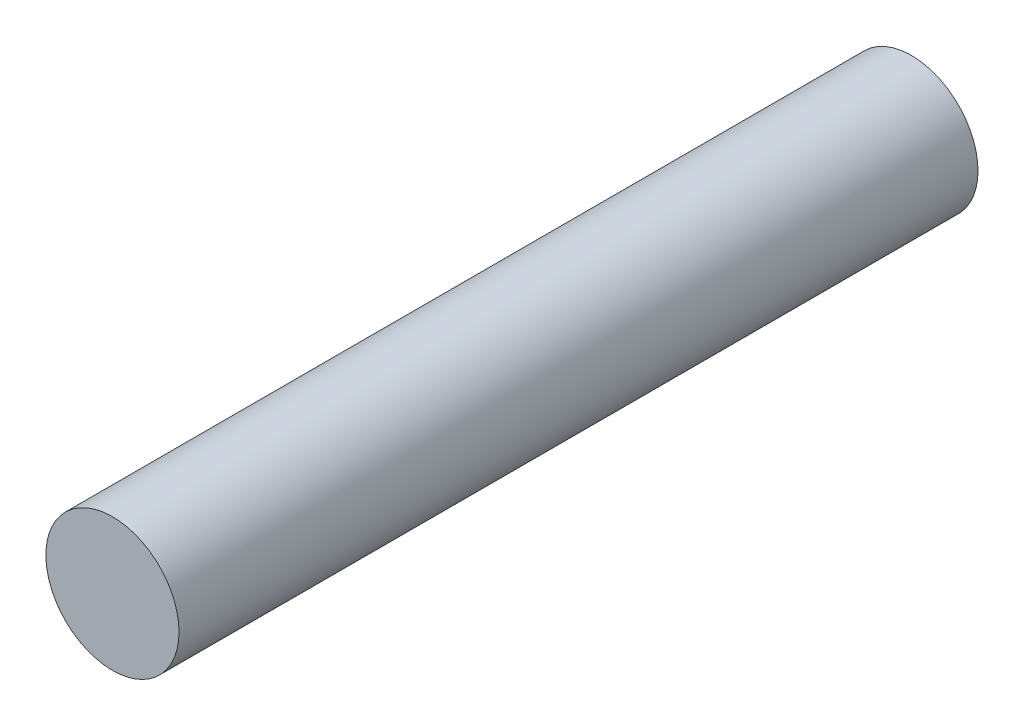
ISO-10303-21;
HEADER;
FILE_DESCRIPTION(('STEP AP214'),'2;1');
FILE_NAME('part.step','',(''),(''),'','','');
FILE_SCHEMA(('AUTOMOTIVE_DESIGN { 1 0 10303 214 1 1 1 1 }'));
ENDSEC;
DATA;
#1=APPLICATION_CONTEXT('core data for automotive mechanical design processes');
#2=APPLICATION_PROTOCOL_DEFINITION('international standard','automotive_design',2000,#1);
#3=PRODUCT_CONTEXT('',#1,'mechanical');
#4=PRODUCT('Part','Part','',(#3));
#5=PRODUCT_RELATED_PRODUCT_CATEGORY('part','',(#4));
#6=PRODUCT_DEFINITION_FORMATION('','',#4);
#7=PRODUCT_DEFINITION_CONTEXT('part definition',#1,'design');
#8=PRODUCT_DEFINITION('design','',#6,#7);
#9=PRODUCT_DEFINITION_SHAPE('','',#8);
#10=(LENGTH_UNIT() NAMED_UNIT(*) SI_UNIT(.MILLI.,.METRE.));
#11=(NAMED_UNIT(*) PLANE_ANGLE_UNIT() SI_UNIT($,.RADIAN.));
#12=(NAMED_UNIT(*) SI_UNIT($,.STERADIAN.) SOLID_ANGLE_UNIT());
#13=UNCERTAINTY_MEASURE_WITH_UNIT(LENGTH_MEASURE(1.E-05),#10,'distance_accuracy_value','');
#14=(GEOMETRIC_REPRESENTATION_CONTEXT(3) GLOBAL_UNCERTAINTY_ASSIGNED_CONTEXT((#13)) GLOBAL_UNIT_ASSIGNED_CONTEXT((#10,
#11,#12)) REPRESENTATION_CONTEXT('',''));
#15=CARTESIAN_POINT('',(0.,0.,0.));
#16=DIRECTION('',(0.,0.,1.));
#17=DIRECTION('',(1.,0.,0.));
#18=AXIS2_PLACEMENT_3D('',#15,#16,#17);
#19=CARTESIAN_POINT('',(0.,0.,60.));
#20=DIRECTION('',(0.,0.,-1.));
#21=DIRECTION('',(-1.,0.,0.));
#22=AXIS2_PLACEMENT_3D('',#19,#20,#21);
#23=CYLINDRICAL_SURFACE('',#22,5.);
#24=CARTESIAN_POINT('',(-5.,0.,54.));
#25=CARTESIAN_POINT('',(-4.99999271227085,-0.107493005442892,53.9999901481763));
#26=CARTESIAN_POINT('',(-4.99649294306932,-0.215172564090673,53.9912822479116));
#27=CARTESIAN_POINT('',(-4.98283453100641,-0.427496480417896,53.9567522964788));
#28=CARTESIAN_POINT('',(-4.97265778698877,-0.532131777561249,53.9308837209139));
#29=CARTESIAN_POINT('',(-4.94674209213119,-0.734953922727403,53.8631239219412));
#30=CARTESIAN_POINT('',(-4.93102136364072,-0.833160661616958,53.8212851537833));
#31=CARTESIAN_POINT('',(-4.89556610796078,-1.02107197032837,53.7229808266735));
#32=CARTESIAN_POINT('',(-4.87583297458057,-1.11077947675099,53.6665203450811));
#33=CARTESIAN_POINT('',(-4.83330886170419,-1.28350100757039,53.5377645014391));
#34=CARTESIAN_POINT('',(-4.81042296929191,-1.36606227255021,53.4648933437597));
#35=CARTESIAN_POINT('',(-4.76460576906195,-1.51817500478472,53.3065999965232));
#36=CARTESIAN_POINT('',(-4.74167444453792,-1.58772010713353,53.2211717027883));
#37=CARTESIAN_POINT('',(-4.69722791797136,-1.71487456729288,53.0355719297577));
#38=CARTESIAN_POINT('',(-4.67582115964951,-1.77181498119547,52.9349135139768));
#39=CARTESIAN_POINT('',(-4.63833647186793,-1.86775471903715,52.72446360158));
#40=CARTESIAN_POINT('',(-4.62225601244176,-1.90676256428584,52.6146764721516));
#41=CARTESIAN_POINT('',(-4.59826357660818,-1.96389882339587,52.3942876664079));
#42=CARTESIAN_POINT('',(-4.59001420355605,-1.98289396580565,52.2839487644238));
#43=CARTESIAN_POINT('',(-4.58164004049144,-2.00217296164003,52.0613650016927));
#44=CARTESIAN_POINT('',(-4.58151125522768,-2.00246601631323,51.949121105375));
#45=CARTESIAN_POINT('',(-4.58910500279994,-1.98498936750455,51.734243328542));
#46=CARTESIAN_POINT('',(-4.5962817503845,-1.96847531430514,51.631484285591));
#47=CARTESIAN_POINT('',(-4.61676187607836,-1.91994688029782,51.4303404439933));
#48=CARTESIAN_POINT('',(-4.63006632321673,-1.88792979480463,51.3319564118897));
#49=CARTESIAN_POINT('',(-4.6615948508853,-1.80869473255108,51.139982163804));
#50=CARTESIAN_POINT('',(-4.67991379280788,-1.76117986231532,51.0465307609453));
#51=CARTESIAN_POINT('',(-4.7193811638989,-1.65250646073222,50.8685841836384));
#52=CARTESIAN_POINT('',(-4.74053065456848,-1.59134280510085,50.7840923905972));
#53=CARTESIAN_POINT('',(-4.78526736742271,-1.45155059945444,50.619590271198));
#54=CARTESIAN_POINT('',(-4.80891664976152,-1.37193746297064,50.540431270554));
#55=CARTESIAN_POINT('',(-4.85459824958282,-1.20031442743019,50.396315521998));
#56=CARTESIAN_POINT('',(-4.87663024445325,-1.10830206533444,50.3313616025897));
#57=CARTESIAN_POINT('',(-4.91714681264548,-0.912077652605845,50.2163825525842));
#58=CARTESIAN_POINT('',(-4.93555270095415,-0.80766049134648,50.1666777188029));
#59=CARTESIAN_POINT('',(-4.96614828328759,-0.591023765482884,50.0858321389219));
#60=CARTESIAN_POINT('',(-4.97834113462382,-0.478808196849676,50.0546819624426));
#61=CARTESIAN_POINT('',(-4.99456139506911,-0.256895887607822,50.0135517045803));
#62=CARTESIAN_POINT('',(-4.99902945833514,-0.147443293985536,50.0024275457464));
#63=CARTESIAN_POINT('',(-5.00068478510631,0.071845309807816,49.9982868994714));
#64=CARTESIAN_POINT('',(-4.99787393582291,0.181681213223923,50.0052657184525));
#65=CARTESIAN_POINT('',(-4.98557567063753,0.393432739121988,50.036291752552));
#66=CARTESIAN_POINT('',(-4.97639391345523,0.495482491775476,50.059557980351));
#67=CARTESIAN_POINT('',(-4.952594414055,0.694135428060782,50.1214357083098));
#68=CARTESIAN_POINT('',(-4.9379759735653,0.790737910224845,50.1600491796687));
#69=CARTESIAN_POINT('',(-4.90416594770812,0.979078785816701,50.2527849396799));
#70=CARTESIAN_POINT('',(-4.88484815979804,1.0705780227554,50.3073454720431));
#71=CARTESIAN_POINT('',(-4.84373364745525,1.24344359124655,50.4299403239056));
#72=CARTESIAN_POINT('',(-4.82193593110271,1.32480584076112,50.4979800429226));
#73=CARTESIAN_POINT('',(-4.77645117638112,1.48072304302882,50.6508700129496));
#74=CARTESIAN_POINT('',(-4.75273441425052,1.55447393380607,50.7365335415062));
#75=CARTESIAN_POINT('',(-4.70741672917132,1.68675119741371,50.9194400830094));
#76=CARTESIAN_POINT('',(-4.68581615526511,1.74527506133751,51.0166850003399));
#77=CARTESIAN_POINT('',(-4.64714299907708,1.84580750193163,51.2214616945941));
#78=CARTESIAN_POINT('',(-4.63011630884788,1.88765059453446,51.3290839992123));
#79=CARTESIAN_POINT('',(-4.60323673477931,1.95229621970531,51.5507336517152));
#80=CARTESIAN_POINT('',(-4.59337855695998,1.97511280526932,51.6647562058124));
#81=CARTESIAN_POINT('',(-4.58271759299926,1.9997156172784,51.8871279017745));
#82=CARTESIAN_POINT('',(-4.58131421008171,2.00289708230287,51.9952948395933));
#83=CARTESIAN_POINT('',(-4.58614836033098,1.99180315927753,52.2105448577133));
#84=CARTESIAN_POINT('',(-4.59238492324793,1.97752998791379,52.3176280739026));
#85=CARTESIAN_POINT('',(-4.61126649079021,1.93307136615365,52.523332189855));
#86=CARTESIAN_POINT('',(-4.62364831827449,1.90353749357098,52.622120274433));
#87=CARTESIAN_POINT('',(-4.65324001232697,1.83000544849101,52.8133786296135));
#88=CARTESIAN_POINT('',(-4.67045121206007,1.78600328139381,52.9058471468998));
#89=CARTESIAN_POINT('',(-4.70898609604491,1.68187276275973,53.0876096192708));
#90=CARTESIAN_POINT('',(-4.73048882313242,1.62096533515949,53.1764186701305));
#91=CARTESIAN_POINT('',(-4.77463804372237,1.4858921192715,53.3429933172038));
#92=CARTESIAN_POINT('',(-4.79728488048406,1.41172233481812,53.4207555721283));
#93=CARTESIAN_POINT('',(-4.84293567087394,1.24650550627247,53.5682028532636));
#94=CARTESIAN_POINT('',(-4.86586757962185,1.15467600114614,53.6370373068981));
#95=CARTESIAN_POINT('',(-4.90800406713717,0.95990032028578,53.7583370426216));
#96=CARTESIAN_POINT('',(-4.92720691092906,0.856949004547236,53.8107947121525));
#97=CARTESIAN_POINT('',(-4.95939714815861,0.6447380624952,53.8966222151903));
#98=CARTESIAN_POINT('',(-4.97249363055028,0.535631618219694,53.9303293235603));
#99=CARTESIAN_POINT('',(-4.99144306209366,0.312876546281221,53.9786391209543));
#100=CARTESIAN_POINT('',(-4.99731899495638,0.199243525858914,53.9933024367439));
#101=CARTESIAN_POINT('',(-4.99975899504136,0.0569122978909314,53.9993953809783));
#102=CARTESIAN_POINT('',(-5.00000192969176,0.0284626887407592,54.0000026086292));
#103=CARTESIAN_POINT('',(-5.,0.,54.));
#104=B_SPLINE_CURVE_WITH_KNOTS('',3,(#24,#25,#26,#27,#28,#29,#30,#31,#32,#33,#34,#35,#36,#37,
#38,#39,#40,#41,#42,#43,#44,#45,#46,#47,#48,#49,#50,#51,#52,#53,#54,#55,#56,#57,#58,#59,#60,#61,
#62,#63,#64,#65,#66,#67,#68,#69,#70,#71,#72,#73,#74,#75,#76,#77,#78,#79,#80,#81,#82,#83,#84,#85,
#86,#87,#88,#89,#90,#91,#92,#93,#94,#95,#96,#97,#98,#99,#100,#101,#102,#103),.UNSPECIFIED.,.T.,
.F.,(4,2,2,2,2,2,2,2,2,2,2,2,2,2,2,2,2,2,2,2,2,2,2,2,2,2,2,2,2,2,2,2,2,2,2,2,2,2,2,4),(0.,
0.322402987893072,0.645683636007934,0.967911457471579,1.29002753567984,1.62597381700397,
1.96208394934411,2.31315258819217,2.66405423118268,2.99904105308829,3.33386306340489,
3.64538328401373,3.95695787256048,4.27489126298817,4.59294421938184,4.93558349186558,
5.27829092839733,5.62776913162807,5.97706956113791,6.30569184528008,6.63422893570083,
6.94800455564367,7.26182048993797,7.58523513398263,7.9087795949897,8.25368474624414,
8.59864669043749,8.9469504514083,9.29499672645935,9.61799673392749,9.94095572563047,
10.2511431854877,10.5614163580516,10.8894546805669,11.2175920134839,11.5670042353384,
11.9165786364053,12.2596430101332,12.6016125240434,12.686980458968),.UNSPECIFIED.);
#105=CARTESIAN_POINT('',(-5.,0.,54.));
#106=VERTEX_POINT('',#105);
#107=EDGE_CURVE('E39',#106,#106,#104,.T.);
#108=ORIENTED_EDGE('',*,*,#107,.T.);
#109=EDGE_LOOP('',(#108));
#110=FACE_BOUND('',#109,.T.);
#111=CARTESIAN_POINT('',(0.,0.,60.));
#112=DIRECTION('',(0.,0.,1.));
#113=DIRECTION('',(1.,0.,0.));
#114=AXIS2_PLACEMENT_3D('',#111,#112,#113);
#115=CIRCLE('',#114,5.);
#116=CARTESIAN_POINT('',(5.,0.,60.));
#117=VERTEX_POINT('',#116);
#118=EDGE_CURVE('E11',#117,#117,#115,.T.);
#119=ORIENTED_EDGE('',*,*,#118,.F.);
#120=EDGE_LOOP('',(#119));
#121=FACE_BOUND('',#120,.T.);
#122=CARTESIAN_POINT('',(0.,0.,0.));
#123=DIRECTION('',(0.,0.,1.));
#124=DIRECTION('',(1.,0.,0.));
#125=AXIS2_PLACEMENT_3D('',#122,#123,#124);
#126=CIRCLE('',#125,5.);
#127=CARTESIAN_POINT('',(5.,0.,0.));
#128=VERTEX_POINT('',#127);
#129=EDGE_CURVE('E48',#128,#128,#126,.T.);
#130=ORIENTED_EDGE('',*,*,#129,.T.);
#131=EDGE_LOOP('',(#130));
#132=FACE_BOUND('',#131,.T.);
#133=ADVANCED_FACE('F35',(#110,#121,#132),#23,.T.);
#134=CARTESIAN_POINT('',(0.,0.,60.));
#135=DIRECTION('',(0.,0.,1.));
#136=DIRECTION('',(1.,0.,0.));
#137=AXIS2_PLACEMENT_3D('',#134,#135,#136);
#138=PLANE('',#137);
#139=ORIENTED_EDGE('',*,*,#118,.T.);
#140=EDGE_LOOP('',(#139));
#141=FACE_BOUND('',#140,.T.);
#142=ADVANCED_FACE('F126',(#141),#138,.T.);
#143=CARTESIAN_POINT('',(0.,0.,0.));
#144=DIRECTION('',(0.,0.,1.));
#145=DIRECTION('',(1.,0.,0.));
#146=AXIS2_PLACEMENT_3D('',#143,#144,#145);
#147=PLANE('',#146);
#148=DIRECTION('',(1.,0.,0.));
#149=VECTOR('',#148,1.);
#150=CARTESIAN_POINT('',(2.5,2.,0.));
#151=LINE('',#150,#149);
#152=CARTESIAN_POINT('',(-2.5,2.,0.));
#153=VERTEX_POINT('',#152);
#154=CARTESIAN_POINT('',(2.5,2.,0.));
#155=VERTEX_POINT('',#154);
#156=EDGE_CURVE('E91',#153,#155,#151,.T.);
#157=ORIENTED_EDGE('',*,*,#156,.F.);
#158=DIRECTION('',(0.,1.,0.));
#159=VECTOR('',#158,1.);
#160=CARTESIAN_POINT('',(-2.5,-2.,0.));
#161=LINE('',#160,#159);
#162=CARTESIAN_POINT('',(-2.5,-2.,0.));
#163=VERTEX_POINT('',#162);
#164=EDGE_CURVE('E56',#163,#153,#161,.T.);
#165=ORIENTED_EDGE('',*,*,#164,.F.);
#166=DIRECTION('',(-1.,0.,0.));
#167=VECTOR('',#166,1.);
#168=CARTESIAN_POINT('',(2.5,-2.,0.));
#169=LINE('',#168,#167);
#170=CARTESIAN_POINT('',(2.5,-2.,0.));
#171=VERTEX_POINT('',#170);
#172=EDGE_CURVE('E107',#171,#163,#169,.T.);
#173=ORIENTED_EDGE('',*,*,#172,.F.);
#174=DIRECTION('',(0.,-1.,0.));
#175=VECTOR('',#174,1.);
#176=CARTESIAN_POINT('',(2.5,-2.,0.));
#177=LINE('',#176,#175);
#178=EDGE_CURVE('E114',#155,#171,#177,.T.);
#179=ORIENTED_EDGE('',*,*,#178,.F.);
#180=EDGE_LOOP('',(#157,#165,#173,#179));
#181=FACE_BOUND('',#180,.T.);
#182=ORIENTED_EDGE('',*,*,#129,.F.);
#183=EDGE_LOOP('',(#182));
#184=FACE_BOUND('',#183,.T.);
#185=ADVANCED_FACE('F123',(#181,#184),#147,.F.);
#186=CARTESIAN_POINT('',(-2.5,-2.,40.));
#187=DIRECTION('',(-1.,0.,0.));
#188=DIRECTION('',(0.,0.,1.));
#189=AXIS2_PLACEMENT_3D('',#186,#187,#188);
#190=PLANE('',#189);
#191=ORIENTED_EDGE('',*,*,#164,.T.);
#192=DIRECTION('',(0.,0.,-1.));
#193=VECTOR('',#192,1.);
#194=CARTESIAN_POINT('',(-2.5,2.,40.));
#195=LINE('',#194,#193);
#196=CARTESIAN_POINT('',(-2.5,2.,40.));
#197=VERTEX_POINT('',#196);
#198=EDGE_CURVE('E79',#197,#153,#195,.T.);
#199=ORIENTED_EDGE('',*,*,#198,.F.);
#200=DIRECTION('',(0.,1.,0.));
#201=VECTOR('',#200,1.);
#202=CARTESIAN_POINT('',(-2.5,-2.,40.));
#203=LINE('',#202,#201);
#204=CARTESIAN_POINT('',(-2.5,-2.,40.));
#205=VERTEX_POINT('',#204);
#206=EDGE_CURVE('E105',#205,#197,#203,.T.);
#207=ORIENTED_EDGE('',*,*,#206,.F.);
#208=DIRECTION('',(0.,0.,-1.));
#209=VECTOR('',#208,1.);
#210=CARTESIAN_POINT('',(-2.5,-2.,40.));
#211=LINE('',#210,#209);
#212=EDGE_CURVE('E64',#205,#163,#211,.T.);
#213=ORIENTED_EDGE('',*,*,#212,.T.);
#214=EDGE_LOOP('',(#191,#199,#207,#213));
#215=FACE_BOUND('',#214,.T.);
#216=ADVANCED_FACE('F125',(#215),#190,.F.);
#217=CARTESIAN_POINT('',(2.5,-2.,40.));
#218=DIRECTION('',(0.,-1.,0.));
#219=DIRECTION('',(0.,0.,-1.));
#220=AXIS2_PLACEMENT_3D('',#217,#218,#219);
#221=PLANE('',#220);
#222=ORIENTED_EDGE('',*,*,#172,.T.);
#223=ORIENTED_EDGE('',*,*,#212,.F.);
#224=DIRECTION('',(-1.,0.,0.));
#225=VECTOR('',#224,1.);
#226=CARTESIAN_POINT('',(2.5,-2.,40.));
#227=LINE('',#226,#225);
#228=CARTESIAN_POINT('',(2.5,-2.,40.));
#229=VERTEX_POINT('',#228);
#230=EDGE_CURVE('E102',#229,#205,#227,.T.);
#231=ORIENTED_EDGE('',*,*,#230,.F.);
#232=DIRECTION('',(0.,0.,-1.));
#233=VECTOR('',#232,1.);
#234=CARTESIAN_POINT('',(2.5,-2.,40.));
#235=LINE('',#234,#233);
#236=EDGE_CURVE('E95',#229,#171,#235,.T.);
#237=ORIENTED_EDGE('',*,*,#236,.T.);
#238=EDGE_LOOP('',(#222,#223,#231,#237));
#239=FACE_BOUND('',#238,.T.);
#240=ADVANCED_FACE('F132',(#239),#221,.F.);
#241=CARTESIAN_POINT('',(2.5,-2.,40.));
#242=DIRECTION('',(1.,0.,0.));
#243=DIRECTION('',(0.,0.,-1.));
#244=AXIS2_PLACEMENT_3D('',#241,#242,#243);
#245=PLANE('',#244);
#246=ORIENTED_EDGE('',*,*,#178,.T.);
#247=ORIENTED_EDGE('',*,*,#236,.F.);
#248=DIRECTION('',(0.,-1.,0.));
#249=VECTOR('',#248,1.);
#250=CARTESIAN_POINT('',(2.5,-2.,40.));
#251=LINE('',#250,#249);
#252=CARTESIAN_POINT('',(2.5,2.,40.));
#253=VERTEX_POINT('',#252);
#254=EDGE_CURVE('E98',#253,#229,#251,.T.);
#255=ORIENTED_EDGE('',*,*,#254,.F.);
#256=DIRECTION('',(0.,0.,-1.));
#257=VECTOR('',#256,1.);
#258=CARTESIAN_POINT('',(2.5,2.,40.));
#259=LINE('',#258,#257);
#260=EDGE_CURVE('E84',#253,#155,#259,.T.);
#261=ORIENTED_EDGE('',*,*,#260,.T.);
#262=EDGE_LOOP('',(#246,#247,#255,#261));
#263=FACE_BOUND('',#262,.T.);
#264=ADVANCED_FACE('F99',(#263),#245,.F.);
#265=CARTESIAN_POINT('',(2.5,2.,40.));
#266=DIRECTION('',(0.,1.,0.));
#267=DIRECTION('',(0.,0.,1.));
#268=AXIS2_PLACEMENT_3D('',#265,#266,#267);
#269=PLANE('',#268);
#270=ORIENTED_EDGE('',*,*,#156,.T.);
#271=ORIENTED_EDGE('',*,*,#260,.F.);
#272=DIRECTION('',(1.,0.,0.));
#273=VECTOR('',#272,1.);
#274=CARTESIAN_POINT('',(2.5,2.,40.));
#275=LINE('',#274,#273);
#276=EDGE_CURVE('E88',#197,#253,#275,.T.);
#277=ORIENTED_EDGE('',*,*,#276,.F.);
#278=ORIENTED_EDGE('',*,*,#198,.T.);
#279=EDGE_LOOP('',(#270,#271,#277,#278));
#280=FACE_BOUND('',#279,.T.);
#281=ADVANCED_FACE('F86',(#280),#269,.F.);
#282=CARTESIAN_POINT('',(0.,0.,40.));
#283=DIRECTION('',(0.,0.,1.));
#284=DIRECTION('',(1.,0.,0.));
#285=AXIS2_PLACEMENT_3D('',#282,#283,#284);
#286=PLANE('',#285);
#287=ORIENTED_EDGE('',*,*,#206,.T.);
#288=ORIENTED_EDGE('',*,*,#276,.T.);
#289=ORIENTED_EDGE('',*,*,#254,.T.);
#290=ORIENTED_EDGE('',*,*,#230,.T.);
#291=EDGE_LOOP('',(#287,#288,#289,#290));
#292=FACE_BOUND('',#291,.T.);
#293=ADVANCED_FACE('F104',(#292),#286,.F.);
#294=CARTESIAN_POINT('',(-40.,0.,52.));
#295=DIRECTION('',(1.,0.,0.));
#296=DIRECTION('',(0.,0.,-1.));
#297=AXIS2_PLACEMENT_3D('',#294,#295,#296);
#298=CYLINDRICAL_SURFACE('',#297,2.);
#299=CARTESIAN_POINT('',(0.,0.,52.));
#300=DIRECTION('',(1.,0.,0.));
#301=DIRECTION('',(0.,0.,-1.));
#302=AXIS2_PLACEMENT_3D('',#299,#300,#301);
#303=CIRCLE('',#302,2.);
#304=CARTESIAN_POINT('',(0.,0.,50.));
#305=VERTEX_POINT('',#304);
#306=EDGE_CURVE('E145',#305,#305,#303,.T.);
#307=ORIENTED_EDGE('',*,*,#306,.T.);
#308=EDGE_LOOP('',(#307));
#309=FACE_BOUND('',#308,.T.);
#310=ORIENTED_EDGE('',*,*,#107,.F.);
#311=EDGE_LOOP('',(#310));
#312=FACE_BOUND('',#311,.T.);
#313=ADVANCED_FACE('F149',(#309,#312),#298,.F.);
#314=CARTESIAN_POINT('',(0.,0.,52.));
#315=DIRECTION('',(1.,0.,0.));
#316=DIRECTION('',(0.,0.,-1.));
#317=AXIS2_PLACEMENT_3D('',#314,#315,#316);
#318=PLANE('',#317);
#319=ORIENTED_EDGE('',*,*,#306,.F.);
#320=EDGE_LOOP('',(#319));
#321=FACE_BOUND('',#320,.T.);
#322=ADVANCED_FACE('F151',(#321),#318,.F.);
#323=CLOSED_SHELL('',(#133,#142,#185,#216,#240,#264,#281,#293,#313,#322));
#324=MANIFOLD_SOLID_BREP('B2',#323);
#325=ADVANCED_BREP_SHAPE_REPRESENTATION('',(#18,#324),#14);
#326=SHAPE_DEFINITION_REPRESENTATION(#9,#325);
ENDSEC;
END-ISO-10303-21;
